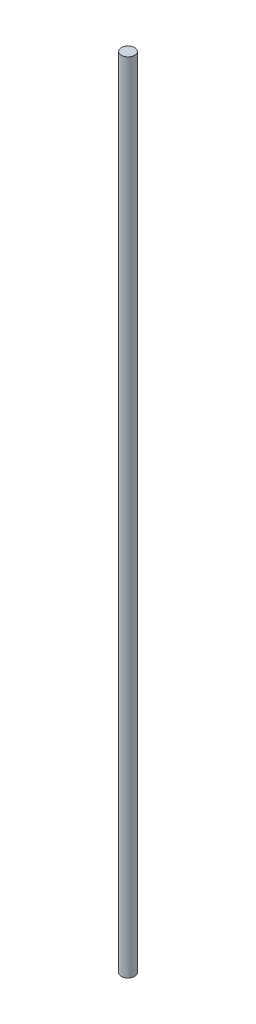
ISO-10303-21;
HEADER;
FILE_DESCRIPTION(('STEP AP214'),'2;1');
FILE_NAME('part.step','',(''),(''),'','','');
FILE_SCHEMA(('AUTOMOTIVE_DESIGN { 1 0 10303 214 1 1 1 1 }'));
ENDSEC;
DATA;
#1=APPLICATION_CONTEXT('core data for automotive mechanical design processes');
#2=APPLICATION_PROTOCOL_DEFINITION('international standard','automotive_design',2000,#1);
#3=PRODUCT_CONTEXT('',#1,'mechanical');
#4=PRODUCT('Part','Part','',(#3));
#5=PRODUCT_RELATED_PRODUCT_CATEGORY('part','',(#4));
#6=PRODUCT_DEFINITION_FORMATION('','',#4);
#7=PRODUCT_DEFINITION_CONTEXT('part definition',#1,'design');
#8=PRODUCT_DEFINITION('design','',#6,#7);
#9=PRODUCT_DEFINITION_SHAPE('','',#8);
#10=(LENGTH_UNIT() NAMED_UNIT(*) SI_UNIT(.MILLI.,.METRE.));
#11=(NAMED_UNIT(*) PLANE_ANGLE_UNIT() SI_UNIT($,.RADIAN.));
#12=(NAMED_UNIT(*) SI_UNIT($,.STERADIAN.) SOLID_ANGLE_UNIT());
#13=UNCERTAINTY_MEASURE_WITH_UNIT(LENGTH_MEASURE(1.E-05),#10,'distance_accuracy_value','');
#14=(GEOMETRIC_REPRESENTATION_CONTEXT(3) GLOBAL_UNCERTAINTY_ASSIGNED_CONTEXT((#13)) GLOBAL_UNIT_ASSIGNED_CONTEXT((#10,
#11,#12)) REPRESENTATION_CONTEXT('',''));
#15=CARTESIAN_POINT('',(0.,0.,0.));
#16=DIRECTION('',(0.,0.,1.));
#17=DIRECTION('',(1.,0.,0.));
#18=AXIS2_PLACEMENT_3D('',#15,#16,#17);
#19=CARTESIAN_POINT('',(0.,381.,0.));
#20=DIRECTION('',(0.,-1.,0.));
#21=DIRECTION('',(0.,0.,-1.));
#22=AXIS2_PLACEMENT_3D('',#19,#20,#21);
#23=CYLINDRICAL_SURFACE('',#22,3.175);
#24=CARTESIAN_POINT('',(0.,381.,0.));
#25=DIRECTION('',(0.,1.,0.));
#26=DIRECTION('',(0.,0.,1.));
#27=AXIS2_PLACEMENT_3D('',#24,#25,#26);
#28=CIRCLE('',#27,3.175);
#29=CARTESIAN_POINT('',(0.,381.,3.175));
#30=VERTEX_POINT('',#29);
#31=EDGE_CURVE('E10',#30,#30,#28,.T.);
#32=ORIENTED_EDGE('',*,*,#31,.F.);
#33=EDGE_LOOP('',(#32));
#34=FACE_BOUND('',#33,.T.);
#35=CARTESIAN_POINT('',(0.,0.,0.));
#36=DIRECTION('',(0.,1.,0.));
#37=DIRECTION('',(0.,0.,1.));
#38=AXIS2_PLACEMENT_3D('',#35,#36,#37);
#39=CIRCLE('',#38,3.175);
#40=CARTESIAN_POINT('',(0.,0.,3.175));
#41=VERTEX_POINT('',#40);
#42=EDGE_CURVE('E46',#41,#41,#39,.T.);
#43=ORIENTED_EDGE('',*,*,#42,.T.);
#44=EDGE_LOOP('',(#43));
#45=FACE_BOUND('',#44,.T.);
#46=ADVANCED_FACE('F43',(#34,#45),#23,.T.);
#47=CARTESIAN_POINT('',(0.,381.,0.));
#48=DIRECTION('',(0.,1.,0.));
#49=DIRECTION('',(0.,0.,1.));
#50=AXIS2_PLACEMENT_3D('',#47,#48,#49);
#51=PLANE('',#50);
#52=ORIENTED_EDGE('',*,*,#31,.T.);
#53=EDGE_LOOP('',(#52));
#54=FACE_BOUND('',#53,.T.);
#55=ADVANCED_FACE('F58',(#54),#51,.T.);
#56=CARTESIAN_POINT('',(0.,0.,0.));
#57=DIRECTION('',(0.,1.,0.));
#58=DIRECTION('',(0.,0.,1.));
#59=AXIS2_PLACEMENT_3D('',#56,#57,#58);
#60=PLANE('',#59);
#61=ORIENTED_EDGE('',*,*,#42,.F.);
#62=EDGE_LOOP('',(#61));
#63=FACE_BOUND('',#62,.T.);
#64=ADVANCED_FACE('F56',(#63),#60,.F.);
#65=CLOSED_SHELL('',(#46,#55,#64));
#66=MANIFOLD_SOLID_BREP('B2',#65);
#67=ADVANCED_BREP_SHAPE_REPRESENTATION('',(#18,#66),#14);
#68=SHAPE_DEFINITION_REPRESENTATION(#9,#67);
ENDSEC;
END-ISO-10303-21;
